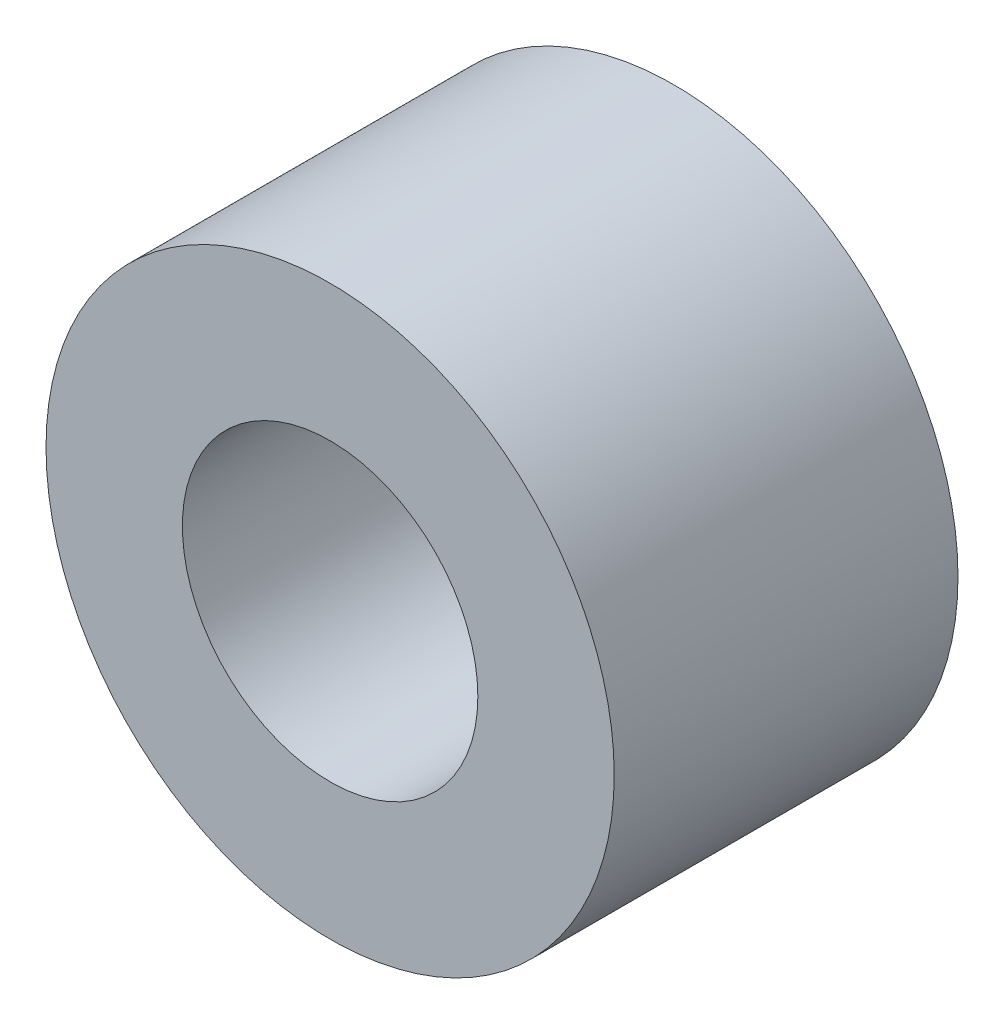
ISO-10303-21;
HEADER;
FILE_DESCRIPTION(('STEP AP214'),'2;1');
FILE_NAME('part.step','',(''),(''),'','','');
FILE_SCHEMA(('AUTOMOTIVE_DESIGN { 1 0 10303 214 1 1 1 1 }'));
ENDSEC;
DATA;
#1=APPLICATION_CONTEXT('core data for automotive mechanical design processes');
#2=APPLICATION_PROTOCOL_DEFINITION('international standard','automotive_design',2000,#1);
#3=PRODUCT_CONTEXT('',#1,'mechanical');
#4=PRODUCT('Part','Part','',(#3));
#5=PRODUCT_RELATED_PRODUCT_CATEGORY('part','',(#4));
#6=PRODUCT_DEFINITION_FORMATION('','',#4);
#7=PRODUCT_DEFINITION_CONTEXT('part definition',#1,'design');
#8=PRODUCT_DEFINITION('design','',#6,#7);
#9=PRODUCT_DEFINITION_SHAPE('','',#8);
#10=(LENGTH_UNIT() NAMED_UNIT(*) SI_UNIT(.MILLI.,.METRE.));
#11=(NAMED_UNIT(*) PLANE_ANGLE_UNIT() SI_UNIT($,.RADIAN.));
#12=(NAMED_UNIT(*) SI_UNIT($,.STERADIAN.) SOLID_ANGLE_UNIT());
#13=UNCERTAINTY_MEASURE_WITH_UNIT(LENGTH_MEASURE(1.E-05),#10,'distance_accuracy_value','');
#14=(GEOMETRIC_REPRESENTATION_CONTEXT(3) GLOBAL_UNCERTAINTY_ASSIGNED_CONTEXT((#13)) GLOBAL_UNIT_ASSIGNED_CONTEXT((#10,
#11,#12)) REPRESENTATION_CONTEXT('',''));
#15=CARTESIAN_POINT('',(0.,0.,0.));
#16=DIRECTION('',(0.,0.,1.));
#17=DIRECTION('',(1.,0.,0.));
#18=AXIS2_PLACEMENT_3D('',#15,#16,#17);
#19=CARTESIAN_POINT('',(0.,0.,7.6835));
#20=DIRECTION('',(0.,0.,1.));
#21=DIRECTION('',(1.,0.,0.));
#22=AXIS2_PLACEMENT_3D('',#19,#20,#21);
#23=PLANE('',#22);
#24=CARTESIAN_POINT('',(0.,0.,7.6835));
#25=DIRECTION('',(0.,0.,1.));
#26=DIRECTION('',(1.,0.,0.));
#27=AXIS2_PLACEMENT_3D('',#24,#25,#26);
#28=CIRCLE('',#27,6.35);
#29=CARTESIAN_POINT('',(6.35,0.,7.6835));
#30=VERTEX_POINT('',#29);
#31=EDGE_CURVE('E10',#30,#30,#28,.T.);
#32=ORIENTED_EDGE('',*,*,#31,.T.);
#33=EDGE_LOOP('',(#32));
#34=FACE_BOUND('',#33,.T.);
#35=CARTESIAN_POINT('',(0.,0.,7.6835));
#36=DIRECTION('',(0.,0.,1.));
#37=DIRECTION('',(1.,0.,0.));
#38=AXIS2_PLACEMENT_3D('',#35,#36,#37);
#39=CIRCLE('',#38,3.302);
#40=CARTESIAN_POINT('',(3.302,0.,7.6835));
#41=VERTEX_POINT('',#40);
#42=EDGE_CURVE('E44',#41,#41,#39,.T.);
#43=ORIENTED_EDGE('',*,*,#42,.F.);
#44=EDGE_LOOP('',(#43));
#45=FACE_BOUND('',#44,.T.);
#46=ADVANCED_FACE('F33',(#34,#45),#23,.T.);
#47=CARTESIAN_POINT('',(0.,0.,0.));
#48=DIRECTION('',(0.,0.,1.));
#49=DIRECTION('',(1.,0.,0.));
#50=AXIS2_PLACEMENT_3D('',#47,#48,#49);
#51=PLANE('',#50);
#52=CARTESIAN_POINT('',(0.,0.,0.));
#53=DIRECTION('',(0.,0.,1.));
#54=DIRECTION('',(1.,0.,0.));
#55=AXIS2_PLACEMENT_3D('',#52,#53,#54);
#56=CIRCLE('',#55,6.35);
#57=CARTESIAN_POINT('',(6.35,0.,0.));
#58=VERTEX_POINT('',#57);
#59=EDGE_CURVE('E37',#58,#58,#56,.T.);
#60=ORIENTED_EDGE('',*,*,#59,.F.);
#61=EDGE_LOOP('',(#60));
#62=FACE_BOUND('',#61,.T.);
#63=CARTESIAN_POINT('',(0.,0.,0.));
#64=DIRECTION('',(0.,0.,1.));
#65=DIRECTION('',(1.,0.,0.));
#66=AXIS2_PLACEMENT_3D('',#63,#64,#65);
#67=CIRCLE('',#66,3.302);
#68=CARTESIAN_POINT('',(3.302,0.,0.));
#69=VERTEX_POINT('',#68);
#70=EDGE_CURVE('E46',#69,#69,#67,.T.);
#71=ORIENTED_EDGE('',*,*,#70,.T.);
#72=EDGE_LOOP('',(#71));
#73=FACE_BOUND('',#72,.T.);
#74=ADVANCED_FACE('F56',(#62,#73),#51,.F.);
#75=CARTESIAN_POINT('',(0.,0.,7.6835));
#76=DIRECTION('',(0.,0.,-1.));
#77=DIRECTION('',(-1.,0.,0.));
#78=AXIS2_PLACEMENT_3D('',#75,#76,#77);
#79=CYLINDRICAL_SURFACE('',#78,6.35);
#80=ORIENTED_EDGE('',*,*,#31,.F.);
#81=EDGE_LOOP('',(#80));
#82=FACE_BOUND('',#81,.T.);
#83=ORIENTED_EDGE('',*,*,#59,.T.);
#84=EDGE_LOOP('',(#83));
#85=FACE_BOUND('',#84,.T.);
#86=ADVANCED_FACE('F35',(#82,#85),#79,.T.);
#87=CARTESIAN_POINT('',(0.,0.,7.6835));
#88=DIRECTION('',(0.,0.,-1.));
#89=DIRECTION('',(-1.,0.,0.));
#90=AXIS2_PLACEMENT_3D('',#87,#88,#89);
#91=CYLINDRICAL_SURFACE('',#90,3.302);
#92=ORIENTED_EDGE('',*,*,#42,.T.);
#93=EDGE_LOOP('',(#92));
#94=FACE_BOUND('',#93,.T.);
#95=ORIENTED_EDGE('',*,*,#70,.F.);
#96=EDGE_LOOP('',(#95));
#97=FACE_BOUND('',#96,.T.);
#98=ADVANCED_FACE('F52',(#94,#97),#91,.F.);
#99=CLOSED_SHELL('',(#46,#74,#86,#98));
#100=MANIFOLD_SOLID_BREP('B2',#99);
#101=ADVANCED_BREP_SHAPE_REPRESENTATION('',(#18,#100),#14);
#102=SHAPE_DEFINITION_REPRESENTATION(#9,#101);
ENDSEC;
END-ISO-10303-21;
